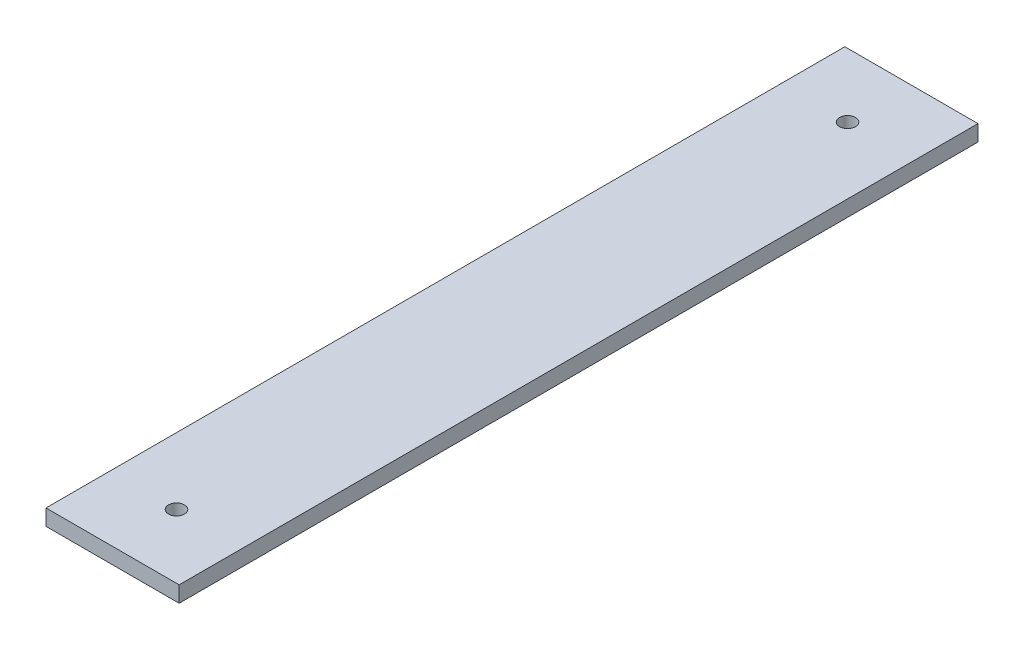
ISO-10303-21;
HEADER;
FILE_DESCRIPTION(('STEP AP214'),'2;1');
FILE_NAME('part.step','',(''),(''),'','','');
FILE_SCHEMA(('AUTOMOTIVE_DESIGN { 1 0 10303 214 1 1 1 1 }'));
ENDSEC;
DATA;
#1=APPLICATION_CONTEXT('core data for automotive mechanical design processes');
#2=APPLICATION_PROTOCOL_DEFINITION('international standard','automotive_design',2000,#1);
#3=PRODUCT_CONTEXT('',#1,'mechanical');
#4=PRODUCT('Part','Part','',(#3));
#5=PRODUCT_RELATED_PRODUCT_CATEGORY('part','',(#4));
#6=PRODUCT_DEFINITION_FORMATION('','',#4);
#7=PRODUCT_DEFINITION_CONTEXT('part definition',#1,'design');
#8=PRODUCT_DEFINITION('design','',#6,#7);
#9=PRODUCT_DEFINITION_SHAPE('','',#8);
#10=(LENGTH_UNIT() NAMED_UNIT(*) SI_UNIT(.MILLI.,.METRE.));
#11=(NAMED_UNIT(*) PLANE_ANGLE_UNIT() SI_UNIT($,.RADIAN.));
#12=(NAMED_UNIT(*) SI_UNIT($,.STERADIAN.) SOLID_ANGLE_UNIT());
#13=UNCERTAINTY_MEASURE_WITH_UNIT(LENGTH_MEASURE(1.E-05),#10,'distance_accuracy_value','');
#14=(GEOMETRIC_REPRESENTATION_CONTEXT(3) GLOBAL_UNCERTAINTY_ASSIGNED_CONTEXT((#13)) GLOBAL_UNIT_ASSIGNED_CONTEXT((#10,
#11,#12)) REPRESENTATION_CONTEXT('',''));
#15=CARTESIAN_POINT('',(0.,0.,0.));
#16=DIRECTION('',(0.,0.,1.));
#17=DIRECTION('',(1.,0.,0.));
#18=AXIS2_PLACEMENT_3D('',#15,#16,#17);
#19=CARTESIAN_POINT('',(12.5,3.,-75.));
#20=DIRECTION('',(-1.,0.,0.));
#21=DIRECTION('',(0.,0.,1.));
#22=AXIS2_PLACEMENT_3D('',#19,#20,#21);
#23=PLANE('',#22);
#24=DIRECTION('',(0.,0.,-1.));
#25=VECTOR('',#24,1.);
#26=CARTESIAN_POINT('',(12.5,0.,-75.));
#27=LINE('',#26,#25);
#28=CARTESIAN_POINT('',(12.5,0.,75.));
#29=VERTEX_POINT('',#28);
#30=CARTESIAN_POINT('',(12.5,0.,-75.));
#31=VERTEX_POINT('',#30);
#32=EDGE_CURVE('E99',#29,#31,#27,.T.);
#33=ORIENTED_EDGE('',*,*,#32,.T.);
#34=DIRECTION('',(0.,-1.,0.));
#35=VECTOR('',#34,1.);
#36=CARTESIAN_POINT('',(12.5,3.,-75.));
#37=LINE('',#36,#35);
#38=CARTESIAN_POINT('',(12.5,3.,-75.));
#39=VERTEX_POINT('',#38);
#40=EDGE_CURVE('E11',#39,#31,#37,.T.);
#41=ORIENTED_EDGE('',*,*,#40,.F.);
#42=DIRECTION('',(0.,0.,-1.));
#43=VECTOR('',#42,1.);
#44=CARTESIAN_POINT('',(12.5,3.,-75.));
#45=LINE('',#44,#43);
#46=CARTESIAN_POINT('',(12.5,3.,75.));
#47=VERTEX_POINT('',#46);
#48=EDGE_CURVE('E86',#47,#39,#45,.T.);
#49=ORIENTED_EDGE('',*,*,#48,.F.);
#50=DIRECTION('',(0.,-1.,0.));
#51=VECTOR('',#50,1.);
#52=CARTESIAN_POINT('',(12.5,3.,75.));
#53=LINE('',#52,#51);
#54=EDGE_CURVE('E95',#47,#29,#53,.T.);
#55=ORIENTED_EDGE('',*,*,#54,.T.);
#56=EDGE_LOOP('',(#33,#41,#49,#55));
#57=FACE_BOUND('',#56,.T.);
#58=ADVANCED_FACE('F33',(#57),#23,.F.);
#59=CARTESIAN_POINT('',(-12.5,3.,-75.));
#60=DIRECTION('',(0.,0.,1.));
#61=DIRECTION('',(1.,0.,0.));
#62=AXIS2_PLACEMENT_3D('',#59,#60,#61);
#63=PLANE('',#62);
#64=DIRECTION('',(-1.,0.,0.));
#65=VECTOR('',#64,1.);
#66=CARTESIAN_POINT('',(-12.5,0.,-75.));
#67=LINE('',#66,#65);
#68=CARTESIAN_POINT('',(-12.5,0.,-75.));
#69=VERTEX_POINT('',#68);
#70=EDGE_CURVE('E90',#31,#69,#67,.T.);
#71=ORIENTED_EDGE('',*,*,#70,.T.);
#72=DIRECTION('',(0.,-1.,0.));
#73=VECTOR('',#72,1.);
#74=CARTESIAN_POINT('',(-12.5,3.,-75.));
#75=LINE('',#74,#73);
#76=CARTESIAN_POINT('',(-12.5,3.,-75.));
#77=VERTEX_POINT('',#76);
#78=EDGE_CURVE('E42',#77,#69,#75,.T.);
#79=ORIENTED_EDGE('',*,*,#78,.F.);
#80=DIRECTION('',(-1.,0.,0.));
#81=VECTOR('',#80,1.);
#82=CARTESIAN_POINT('',(-12.5,3.,-75.));
#83=LINE('',#82,#81);
#84=EDGE_CURVE('E81',#39,#77,#83,.T.);
#85=ORIENTED_EDGE('',*,*,#84,.F.);
#86=ORIENTED_EDGE('',*,*,#40,.T.);
#87=EDGE_LOOP('',(#71,#79,#85,#86));
#88=FACE_BOUND('',#87,.T.);
#89=ADVANCED_FACE('F89',(#88),#63,.F.);
#90=CARTESIAN_POINT('',(-12.5,3.,-75.));
#91=DIRECTION('',(1.,0.,0.));
#92=DIRECTION('',(0.,0.,-1.));
#93=AXIS2_PLACEMENT_3D('',#90,#91,#92);
#94=PLANE('',#93);
#95=DIRECTION('',(0.,0.,1.));
#96=VECTOR('',#95,1.);
#97=CARTESIAN_POINT('',(-12.5,0.,-75.));
#98=LINE('',#97,#96);
#99=CARTESIAN_POINT('',(-12.5,0.,75.));
#100=VERTEX_POINT('',#99);
#101=EDGE_CURVE('E68',#69,#100,#98,.T.);
#102=ORIENTED_EDGE('',*,*,#101,.T.);
#103=DIRECTION('',(0.,-1.,0.));
#104=VECTOR('',#103,1.);
#105=CARTESIAN_POINT('',(-12.5,3.,75.));
#106=LINE('',#105,#104);
#107=CARTESIAN_POINT('',(-12.5,3.,75.));
#108=VERTEX_POINT('',#107);
#109=EDGE_CURVE('E91',#108,#100,#106,.T.);
#110=ORIENTED_EDGE('',*,*,#109,.F.);
#111=DIRECTION('',(0.,0.,1.));
#112=VECTOR('',#111,1.);
#113=CARTESIAN_POINT('',(-12.5,3.,-75.));
#114=LINE('',#113,#112);
#115=EDGE_CURVE('E84',#77,#108,#114,.T.);
#116=ORIENTED_EDGE('',*,*,#115,.F.);
#117=ORIENTED_EDGE('',*,*,#78,.T.);
#118=EDGE_LOOP('',(#102,#110,#116,#117));
#119=FACE_BOUND('',#118,.T.);
#120=ADVANCED_FACE('F93',(#119),#94,.F.);
#121=CARTESIAN_POINT('',(-12.5,3.,75.));
#122=DIRECTION('',(0.,0.,-1.));
#123=DIRECTION('',(-1.,0.,0.));
#124=AXIS2_PLACEMENT_3D('',#121,#122,#123);
#125=PLANE('',#124);
#126=DIRECTION('',(1.,0.,0.));
#127=VECTOR('',#126,1.);
#128=CARTESIAN_POINT('',(-12.5,0.,75.));
#129=LINE('',#128,#127);
#130=EDGE_CURVE('E74',#100,#29,#129,.T.);
#131=ORIENTED_EDGE('',*,*,#130,.T.);
#132=ORIENTED_EDGE('',*,*,#54,.F.);
#133=DIRECTION('',(1.,0.,0.));
#134=VECTOR('',#133,1.);
#135=CARTESIAN_POINT('',(-12.5,3.,75.));
#136=LINE('',#135,#134);
#137=EDGE_CURVE('E51',#108,#47,#136,.T.);
#138=ORIENTED_EDGE('',*,*,#137,.F.);
#139=ORIENTED_EDGE('',*,*,#109,.T.);
#140=EDGE_LOOP('',(#131,#132,#138,#139));
#141=FACE_BOUND('',#140,.T.);
#142=ADVANCED_FACE('F136',(#141),#125,.F.);
#143=CARTESIAN_POINT('',(0.,3.,0.));
#144=DIRECTION('',(0.,1.,0.));
#145=DIRECTION('',(0.,0.,1.));
#146=AXIS2_PLACEMENT_3D('',#143,#144,#145);
#147=PLANE('',#146);
#148=CARTESIAN_POINT('',(0.,3.,63.));
#149=DIRECTION('',(0.,-1.,0.));
#150=DIRECTION('',(0.,0.,-1.));
#151=AXIS2_PLACEMENT_3D('',#148,#149,#150);
#152=CIRCLE('',#151,1.5);
#153=CARTESIAN_POINT('',(0.,3.,61.5));
#154=VERTEX_POINT('',#153);
#155=EDGE_CURVE('E116',#154,#154,#152,.T.);
#156=ORIENTED_EDGE('',*,*,#155,.T.);
#157=EDGE_LOOP('',(#156));
#158=FACE_BOUND('',#157,.T.);
#159=CARTESIAN_POINT('',(0.,3.,-63.));
#160=DIRECTION('',(0.,1.,0.));
#161=DIRECTION('',(0.,0.,1.));
#162=AXIS2_PLACEMENT_3D('',#159,#160,#161);
#163=CIRCLE('',#162,1.5);
#164=CARTESIAN_POINT('',(0.,3.,-61.5));
#165=VERTEX_POINT('',#164);
#166=EDGE_CURVE('E108',#165,#165,#163,.T.);
#167=ORIENTED_EDGE('',*,*,#166,.F.);
#168=EDGE_LOOP('',(#167));
#169=FACE_BOUND('',#168,.T.);
#170=ORIENTED_EDGE('',*,*,#48,.T.);
#171=ORIENTED_EDGE('',*,*,#84,.T.);
#172=ORIENTED_EDGE('',*,*,#115,.T.);
#173=ORIENTED_EDGE('',*,*,#137,.T.);
#174=EDGE_LOOP('',(#170,#171,#172,#173));
#175=FACE_BOUND('',#174,.T.);
#176=ADVANCED_FACE('F82',(#158,#169,#175),#147,.T.);
#177=CARTESIAN_POINT('',(0.,0.,0.));
#178=DIRECTION('',(0.,1.,0.));
#179=DIRECTION('',(0.,0.,1.));
#180=AXIS2_PLACEMENT_3D('',#177,#178,#179);
#181=PLANE('',#180);
#182=CARTESIAN_POINT('',(0.,0.,63.));
#183=DIRECTION('',(0.,1.,0.));
#184=DIRECTION('',(0.,0.,1.));
#185=AXIS2_PLACEMENT_3D('',#182,#183,#184);
#186=CIRCLE('',#185,1.5);
#187=CARTESIAN_POINT('',(0.,0.,64.5));
#188=VERTEX_POINT('',#187);
#189=EDGE_CURVE('E36',#188,#188,#186,.F.);
#190=ORIENTED_EDGE('',*,*,#189,.F.);
#191=EDGE_LOOP('',(#190));
#192=FACE_BOUND('',#191,.T.);
#193=CARTESIAN_POINT('',(0.,0.,-63.));
#194=DIRECTION('',(0.,1.,0.));
#195=DIRECTION('',(0.,0.,1.));
#196=AXIS2_PLACEMENT_3D('',#193,#194,#195);
#197=CIRCLE('',#196,1.5);
#198=CARTESIAN_POINT('',(0.,0.,-61.5));
#199=VERTEX_POINT('',#198);
#200=EDGE_CURVE('E102',#199,#199,#197,.T.);
#201=ORIENTED_EDGE('',*,*,#200,.T.);
#202=EDGE_LOOP('',(#201));
#203=FACE_BOUND('',#202,.T.);
#204=ORIENTED_EDGE('',*,*,#32,.F.);
#205=ORIENTED_EDGE('',*,*,#130,.F.);
#206=ORIENTED_EDGE('',*,*,#101,.F.);
#207=ORIENTED_EDGE('',*,*,#70,.F.);
#208=EDGE_LOOP('',(#204,#205,#206,#207));
#209=FACE_BOUND('',#208,.T.);
#210=ADVANCED_FACE('F130',(#192,#203,#209),#181,.F.);
#211=CARTESIAN_POINT('',(0.,-8.,-63.));
#212=DIRECTION('',(0.,1.,0.));
#213=DIRECTION('',(0.,0.,1.));
#214=AXIS2_PLACEMENT_3D('',#211,#212,#213);
#215=CYLINDRICAL_SURFACE('',#214,1.5);
#216=ORIENTED_EDGE('',*,*,#166,.T.);
#217=EDGE_LOOP('',(#216));
#218=FACE_BOUND('',#217,.T.);
#219=ORIENTED_EDGE('',*,*,#200,.F.);
#220=EDGE_LOOP('',(#219));
#221=FACE_BOUND('',#220,.T.);
#222=ADVANCED_FACE('F126',(#218,#221),#215,.F.);
#223=CARTESIAN_POINT('',(0.,-8.,63.));
#224=DIRECTION('',(0.,1.,0.));
#225=DIRECTION('',(0.,0.,1.));
#226=AXIS2_PLACEMENT_3D('',#223,#224,#225);
#227=CYLINDRICAL_SURFACE('',#226,1.5);
#228=ORIENTED_EDGE('',*,*,#155,.F.);
#229=EDGE_LOOP('',(#228));
#230=FACE_BOUND('',#229,.T.);
#231=ORIENTED_EDGE('',*,*,#189,.T.);
#232=EDGE_LOOP('',(#231));
#233=FACE_BOUND('',#232,.T.);
#234=ADVANCED_FACE('F123',(#230,#233),#227,.F.);
#235=CLOSED_SHELL('',(#58,#89,#120,#142,#176,#210,#222,#234));
#236=MANIFOLD_SOLID_BREP('B2',#235);
#237=ADVANCED_BREP_SHAPE_REPRESENTATION('',(#18,#236),#14);
#238=SHAPE_DEFINITION_REPRESENTATION(#9,#237);
ENDSEC;
END-ISO-10303-21;
